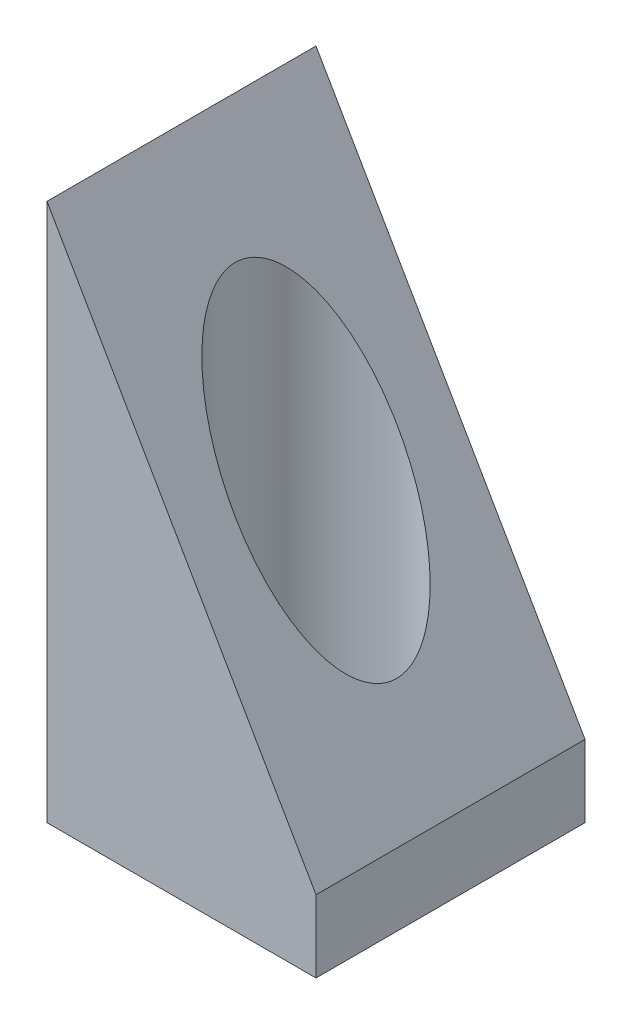
ISO-10303-21;
HEADER;
FILE_DESCRIPTION(('STEP AP214'),'2;1');
FILE_NAME('part.step','',(''),(''),'','','');
FILE_SCHEMA(('AUTOMOTIVE_DESIGN { 1 0 10303 214 1 1 1 1 }'));
ENDSEC;
DATA;
#1=APPLICATION_CONTEXT('core data for automotive mechanical design processes');
#2=APPLICATION_PROTOCOL_DEFINITION('international standard','automotive_design',2000,#1);
#3=PRODUCT_CONTEXT('',#1,'mechanical');
#4=PRODUCT('Part','Part','',(#3));
#5=PRODUCT_RELATED_PRODUCT_CATEGORY('part','',(#4));
#6=PRODUCT_DEFINITION_FORMATION('','',#4);
#7=PRODUCT_DEFINITION_CONTEXT('part definition',#1,'design');
#8=PRODUCT_DEFINITION('design','',#6,#7);
#9=PRODUCT_DEFINITION_SHAPE('','',#8);
#10=(LENGTH_UNIT() NAMED_UNIT(*) SI_UNIT(.MILLI.,.METRE.));
#11=(NAMED_UNIT(*) PLANE_ANGLE_UNIT() SI_UNIT($,.RADIAN.));
#12=(NAMED_UNIT(*) SI_UNIT($,.STERADIAN.) SOLID_ANGLE_UNIT());
#13=UNCERTAINTY_MEASURE_WITH_UNIT(LENGTH_MEASURE(1.E-05),#10,'distance_accuracy_value','');
#14=(GEOMETRIC_REPRESENTATION_CONTEXT(3) GLOBAL_UNCERTAINTY_ASSIGNED_CONTEXT((#13)) GLOBAL_UNIT_ASSIGNED_CONTEXT((#10,
#11,#12)) REPRESENTATION_CONTEXT('',''));
#15=CARTESIAN_POINT('',(0.,0.,0.));
#16=DIRECTION('',(0.,0.,1.));
#17=DIRECTION('',(1.,0.,0.));
#18=AXIS2_PLACEMENT_3D('',#15,#16,#17);
#19=CARTESIAN_POINT('',(20.,0.,-20.));
#20=DIRECTION('',(0.,-1.,0.));
#21=DIRECTION('',(0.,0.,-1.));
#22=AXIS2_PLACEMENT_3D('',#19,#20,#21);
#23=PLANE('',#22);
#24=DIRECTION('',(0.,0.,-1.));
#25=VECTOR('',#24,1.);
#26=CARTESIAN_POINT('',(20.,0.,20.));
#27=LINE('',#26,#25);
#28=CARTESIAN_POINT('',(20.,0.,20.));
#29=VERTEX_POINT('',#28);
#30=CARTESIAN_POINT('',(20.,0.,-20.));
#31=VERTEX_POINT('',#30);
#32=EDGE_CURVE('E87',#29,#31,#27,.T.);
#33=ORIENTED_EDGE('',*,*,#32,.F.);
#34=DIRECTION('',(1.,0.,0.));
#35=VECTOR('',#34,1.);
#36=CARTESIAN_POINT('',(-20.,0.,20.));
#37=LINE('',#36,#35);
#38=CARTESIAN_POINT('',(-20.,0.,20.));
#39=VERTEX_POINT('',#38);
#40=EDGE_CURVE('E74',#39,#29,#37,.T.);
#41=ORIENTED_EDGE('',*,*,#40,.F.);
#42=DIRECTION('',(0.,0.,1.));
#43=VECTOR('',#42,1.);
#44=CARTESIAN_POINT('',(-20.,0.,20.));
#45=LINE('',#44,#43);
#46=CARTESIAN_POINT('',(-20.,0.,-20.));
#47=VERTEX_POINT('',#46);
#48=EDGE_CURVE('E65',#47,#39,#45,.T.);
#49=ORIENTED_EDGE('',*,*,#48,.F.);
#50=DIRECTION('',(-1.,0.,0.));
#51=VECTOR('',#50,1.);
#52=CARTESIAN_POINT('',(-20.,0.,-20.));
#53=LINE('',#52,#51);
#54=EDGE_CURVE('E75',#31,#47,#53,.T.);
#55=ORIENTED_EDGE('',*,*,#54,.F.);
#56=EDGE_LOOP('',(#33,#41,#49,#55));
#57=FACE_BOUND('',#56,.T.);
#58=CARTESIAN_POINT('',(0.,0.,0.));
#59=DIRECTION('',(0.,1.,0.));
#60=DIRECTION('',(0.,0.,1.));
#61=AXIS2_PLACEMENT_3D('',#58,#59,#60);
#62=CIRCLE('',#61,12.);
#63=CARTESIAN_POINT('',(0.,0.,12.));
#64=VERTEX_POINT('',#63);
#65=EDGE_CURVE('E100',#64,#64,#62,.T.);
#66=ORIENTED_EDGE('',*,*,#65,.T.);
#67=EDGE_LOOP('',(#66));
#68=FACE_BOUND('',#67,.T.);
#69=ADVANCED_FACE('F31',(#57,#68),#23,.T.);
#70=CARTESIAN_POINT('',(20.,80.,20.));
#71=DIRECTION('',(-1.,0.,0.));
#72=DIRECTION('',(0.,0.,1.));
#73=AXIS2_PLACEMENT_3D('',#70,#71,#72);
#74=PLANE('',#73);
#75=DIRECTION('',(0.,-1.,0.));
#76=VECTOR('',#75,1.);
#77=CARTESIAN_POINT('',(20.,80.,-20.));
#78=LINE('',#77,#76);
#79=CARTESIAN_POINT('',(20.,10.717967697244,-20.));
#80=VERTEX_POINT('',#79);
#81=EDGE_CURVE('E40',#80,#31,#78,.T.);
#82=ORIENTED_EDGE('',*,*,#81,.F.);
#83=DIRECTION('',(0.,0.,-1.));
#84=VECTOR('',#83,1.);
#85=CARTESIAN_POINT('',(20.,10.717967697244,147.474487139159));
#86=LINE('',#85,#84);
#87=CARTESIAN_POINT('',(20.,10.717967697244,20.));
#88=VERTEX_POINT('',#87);
#89=EDGE_CURVE('E107',#88,#80,#86,.T.);
#90=ORIENTED_EDGE('',*,*,#89,.F.);
#91=DIRECTION('',(0.,-1.,0.));
#92=VECTOR('',#91,1.);
#93=CARTESIAN_POINT('',(20.,80.,20.));
#94=LINE('',#93,#92);
#95=EDGE_CURVE('E83',#88,#29,#94,.T.);
#96=ORIENTED_EDGE('',*,*,#95,.T.);
#97=ORIENTED_EDGE('',*,*,#32,.T.);
#98=EDGE_LOOP('',(#82,#90,#96,#97));
#99=FACE_BOUND('',#98,.T.);
#100=ADVANCED_FACE('F33',(#99),#74,.F.);
#101=CARTESIAN_POINT('',(-20.,80.,-20.));
#102=DIRECTION('',(0.,0.,1.));
#103=DIRECTION('',(1.,0.,0.));
#104=AXIS2_PLACEMENT_3D('',#101,#102,#103);
#105=PLANE('',#104);
#106=DIRECTION('',(0.,-1.,0.));
#107=VECTOR('',#106,1.);
#108=CARTESIAN_POINT('',(-20.,80.,-20.));
#109=LINE('',#108,#107);
#110=CARTESIAN_POINT('',(-20.,80.,-20.));
#111=VERTEX_POINT('',#110);
#112=EDGE_CURVE('E70',#111,#47,#109,.T.);
#113=ORIENTED_EDGE('',*,*,#112,.F.);
#114=DIRECTION('',(0.499999999999995,-0.866025403784442,0.));
#115=VECTOR('',#114,1.);
#116=CARTESIAN_POINT('',(-20.,80.,-20.));
#117=LINE('',#116,#115);
#118=EDGE_CURVE('E97',#111,#80,#117,.T.);
#119=ORIENTED_EDGE('',*,*,#118,.T.);
#120=ORIENTED_EDGE('',*,*,#81,.T.);
#121=ORIENTED_EDGE('',*,*,#54,.T.);
#122=EDGE_LOOP('',(#113,#119,#120,#121));
#123=FACE_BOUND('',#122,.T.);
#124=ADVANCED_FACE('F96',(#123),#105,.F.);
#125=CARTESIAN_POINT('',(-20.,80.,20.));
#126=DIRECTION('',(1.,0.,0.));
#127=DIRECTION('',(0.,0.,-1.));
#128=AXIS2_PLACEMENT_3D('',#125,#126,#127);
#129=PLANE('',#128);
#130=ORIENTED_EDGE('',*,*,#48,.T.);
#131=DIRECTION('',(0.,-1.,0.));
#132=VECTOR('',#131,1.);
#133=CARTESIAN_POINT('',(-20.,80.,20.));
#134=LINE('',#133,#132);
#135=CARTESIAN_POINT('',(-20.,80.,20.));
#136=VERTEX_POINT('',#135);
#137=EDGE_CURVE('E68',#136,#39,#134,.T.);
#138=ORIENTED_EDGE('',*,*,#137,.F.);
#139=DIRECTION('',(0.,0.,1.));
#140=VECTOR('',#139,1.);
#141=CARTESIAN_POINT('',(-20.,80.,20.));
#142=LINE('',#141,#140);
#143=EDGE_CURVE('E47',#111,#136,#142,.T.);
#144=ORIENTED_EDGE('',*,*,#143,.F.);
#145=ORIENTED_EDGE('',*,*,#112,.T.);
#146=EDGE_LOOP('',(#130,#138,#144,#145));
#147=FACE_BOUND('',#146,.T.);
#148=ADVANCED_FACE('F67',(#147),#129,.F.);
#149=CARTESIAN_POINT('',(-20.,80.,20.));
#150=DIRECTION('',(0.,0.,-1.));
#151=DIRECTION('',(-1.,0.,0.));
#152=AXIS2_PLACEMENT_3D('',#149,#150,#151);
#153=PLANE('',#152);
#154=ORIENTED_EDGE('',*,*,#95,.F.);
#155=DIRECTION('',(-0.499999999999995,0.866025403784442,0.));
#156=VECTOR('',#155,1.);
#157=CARTESIAN_POINT('',(-20.,80.,20.));
#158=LINE('',#157,#156);
#159=EDGE_CURVE('E82',#88,#136,#158,.T.);
#160=ORIENTED_EDGE('',*,*,#159,.T.);
#161=ORIENTED_EDGE('',*,*,#137,.T.);
#162=ORIENTED_EDGE('',*,*,#40,.T.);
#163=EDGE_LOOP('',(#154,#160,#161,#162));
#164=FACE_BOUND('',#163,.T.);
#165=ADVANCED_FACE('F80',(#164),#153,.F.);
#166=CARTESIAN_POINT('',(0.,80.,0.));
#167=DIRECTION('',(0.,-1.,0.));
#168=DIRECTION('',(0.,0.,-1.));
#169=AXIS2_PLACEMENT_3D('',#166,#167,#168);
#170=CYLINDRICAL_SURFACE('',#169,12.);
#171=CARTESIAN_POINT('',(0.,45.358983848622,0.));
#172=DIRECTION('',(-0.866025403784442,-0.499999999999995,0.));
#173=DIRECTION('',(0.499999999999995,-0.866025403784442,0.));
#174=AXIS2_PLACEMENT_3D('',#171,#172,#173);
#175=ELLIPSE('',#174,24.0000000000002,12.);
#176=CARTESIAN_POINT('',(12.,24.5743741577952,0.));
#177=VERTEX_POINT('',#176);
#178=EDGE_CURVE('E11',#177,#177,#175,.T.);
#179=ORIENTED_EDGE('',*,*,#178,.F.);
#180=EDGE_LOOP('',(#179));
#181=FACE_BOUND('',#180,.T.);
#182=ORIENTED_EDGE('',*,*,#65,.F.);
#183=EDGE_LOOP('',(#182));
#184=FACE_BOUND('',#183,.T.);
#185=ADVANCED_FACE('F114',(#181,#184),#170,.F.);
#186=CARTESIAN_POINT('',(20.,10.717967697244,147.474487139159));
#187=DIRECTION('',(-0.866025403784442,-0.499999999999995,0.));
#188=DIRECTION('',(0.499999999999995,-0.866025403784442,0.));
#189=AXIS2_PLACEMENT_3D('',#186,#187,#188);
#190=PLANE('',#189);
#191=ORIENTED_EDGE('',*,*,#178,.T.);
#192=EDGE_LOOP('',(#191));
#193=FACE_BOUND('',#192,.T.);
#194=ORIENTED_EDGE('',*,*,#118,.F.);
#195=ORIENTED_EDGE('',*,*,#143,.T.);
#196=ORIENTED_EDGE('',*,*,#159,.F.);
#197=ORIENTED_EDGE('',*,*,#89,.T.);
#198=EDGE_LOOP('',(#194,#195,#196,#197));
#199=FACE_BOUND('',#198,.T.);
#200=ADVANCED_FACE('F109',(#193,#199),#190,.F.);
#201=CLOSED_SHELL('',(#69,#100,#124,#148,#165,#185,#200));
#202=MANIFOLD_SOLID_BREP('B2',#201);
#203=ADVANCED_BREP_SHAPE_REPRESENTATION('',(#18,#202),#14);
#204=SHAPE_DEFINITION_REPRESENTATION(#9,#203);
ENDSEC;
END-ISO-10303-21;
